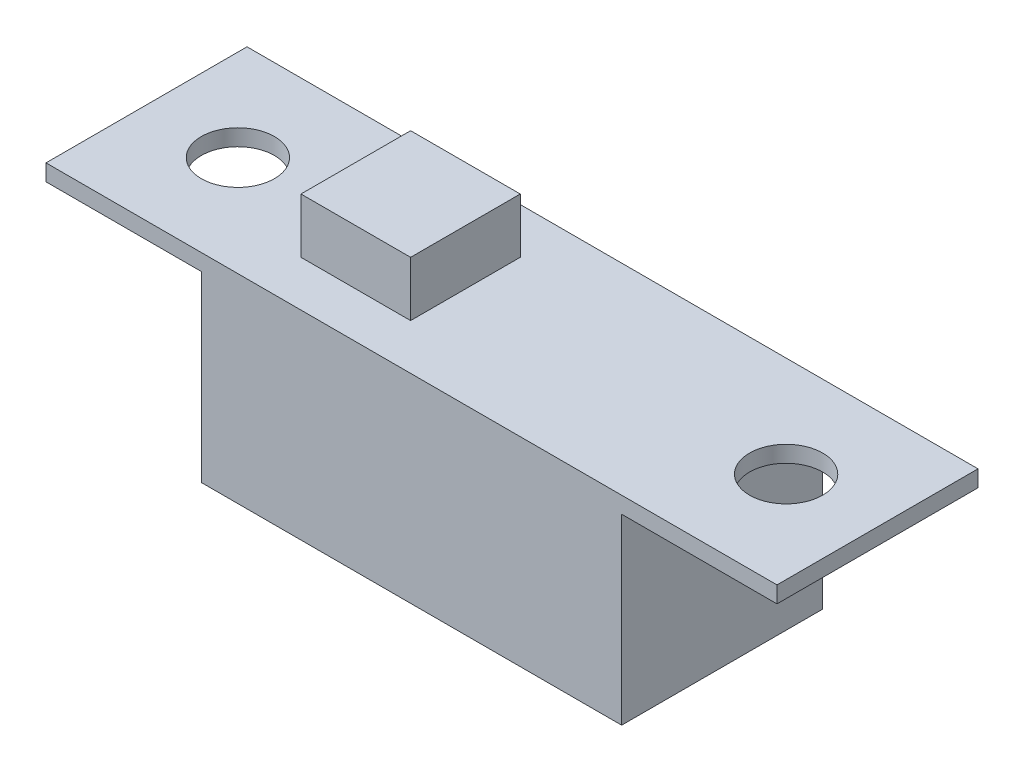
ISO-10303-21;
HEADER;
FILE_DESCRIPTION(('STEP AP214'),'2;1');
FILE_NAME('part.step','',(''),(''),'','','');
FILE_SCHEMA(('AUTOMOTIVE_DESIGN { 1 0 10303 214 1 1 1 1 }'));
ENDSEC;
DATA;
#1=APPLICATION_CONTEXT('core data for automotive mechanical design processes');
#2=APPLICATION_PROTOCOL_DEFINITION('international standard','automotive_design',2000,#1);
#3=PRODUCT_CONTEXT('',#1,'mechanical');
#4=PRODUCT('Part','Part','',(#3));
#5=PRODUCT_RELATED_PRODUCT_CATEGORY('part','',(#4));
#6=PRODUCT_DEFINITION_FORMATION('','',#4);
#7=PRODUCT_DEFINITION_CONTEXT('part definition',#1,'design');
#8=PRODUCT_DEFINITION('design','',#6,#7);
#9=PRODUCT_DEFINITION_SHAPE('','',#8);
#10=(LENGTH_UNIT() NAMED_UNIT(*) SI_UNIT(.MILLI.,.METRE.));
#11=(NAMED_UNIT(*) PLANE_ANGLE_UNIT() SI_UNIT($,.RADIAN.));
#12=(NAMED_UNIT(*) SI_UNIT($,.STERADIAN.) SOLID_ANGLE_UNIT());
#13=UNCERTAINTY_MEASURE_WITH_UNIT(LENGTH_MEASURE(1.E-05),#10,'distance_accuracy_value','');
#14=(GEOMETRIC_REPRESENTATION_CONTEXT(3) GLOBAL_UNCERTAINTY_ASSIGNED_CONTEXT((#13)) GLOBAL_UNIT_ASSIGNED_CONTEXT((#10,
#11,#12)) REPRESENTATION_CONTEXT('',''));
#15=CARTESIAN_POINT('',(0.,0.,0.));
#16=DIRECTION('',(0.,0.,1.));
#17=DIRECTION('',(1.,0.,0.));
#18=AXIS2_PLACEMENT_3D('',#15,#16,#17);
#19=CARTESIAN_POINT('',(0.,0.45,0.));
#20=DIRECTION('',(0.,-1.,0.));
#21=DIRECTION('',(0.,0.,-1.));
#22=AXIS2_PLACEMENT_3D('',#19,#20,#21);
#23=PLANE('',#22);
#24=CARTESIAN_POINT('',(7.5,0.45,0.));
#25=DIRECTION('',(0.,1.,0.));
#26=DIRECTION('',(0.,0.,1.));
#27=AXIS2_PLACEMENT_3D('',#24,#25,#26);
#28=CIRCLE('',#27,1.);
#29=CARTESIAN_POINT('',(7.5,0.45,0.999999999999998));
#30=VERTEX_POINT('',#29);
#31=EDGE_CURVE('E180',#30,#30,#28,.T.);
#32=ORIENTED_EDGE('',*,*,#31,.F.);
#33=EDGE_LOOP('',(#32));
#34=FACE_BOUND('',#33,.T.);
#35=CARTESIAN_POINT('',(-7.5,0.45,0.));
#36=DIRECTION('',(0.,1.,0.));
#37=DIRECTION('',(0.,0.,1.));
#38=AXIS2_PLACEMENT_3D('',#35,#36,#37);
#39=CIRCLE('',#38,1.);
#40=CARTESIAN_POINT('',(-7.5,0.45,1.));
#41=VERTEX_POINT('',#40);
#42=EDGE_CURVE('E186',#41,#41,#39,.T.);
#43=ORIENTED_EDGE('',*,*,#42,.F.);
#44=EDGE_LOOP('',(#43));
#45=FACE_BOUND('',#44,.T.);
#46=DIRECTION('',(0.,0.,-1.));
#47=VECTOR('',#46,1.);
#48=CARTESIAN_POINT('',(10.,0.45,2.75));
#49=LINE('',#48,#47);
#50=CARTESIAN_POINT('',(10.,0.45,2.75));
#51=VERTEX_POINT('',#50);
#52=CARTESIAN_POINT('',(10.,0.45,-2.75));
#53=VERTEX_POINT('',#52);
#54=EDGE_CURVE('E192',#51,#53,#49,.T.);
#55=ORIENTED_EDGE('',*,*,#54,.T.);
#56=DIRECTION('',(-1.,0.,0.));
#57=VECTOR('',#56,1.);
#58=CARTESIAN_POINT('',(-10.,0.45,-2.75));
#59=LINE('',#58,#57);
#60=CARTESIAN_POINT('',(-10.,0.45,-2.75));
#61=VERTEX_POINT('',#60);
#62=EDGE_CURVE('E195',#53,#61,#59,.T.);
#63=ORIENTED_EDGE('',*,*,#62,.T.);
#64=DIRECTION('',(0.,0.,1.));
#65=VECTOR('',#64,1.);
#66=CARTESIAN_POINT('',(-10.,0.45,2.75));
#67=LINE('',#66,#65);
#68=CARTESIAN_POINT('',(-10.,0.45,2.75));
#69=VERTEX_POINT('',#68);
#70=EDGE_CURVE('E198',#61,#69,#67,.T.);
#71=ORIENTED_EDGE('',*,*,#70,.T.);
#72=DIRECTION('',(1.,0.,0.));
#73=VECTOR('',#72,1.);
#74=CARTESIAN_POINT('',(-10.,0.45,2.75));
#75=LINE('',#74,#73);
#76=EDGE_CURVE('E200',#69,#51,#75,.T.);
#77=ORIENTED_EDGE('',*,*,#76,.T.);
#78=EDGE_LOOP('',(#55,#63,#71,#77));
#79=FACE_BOUND('',#78,.T.);
#80=DIRECTION('',(0.,0.,-1.));
#81=VECTOR('',#80,1.);
#82=CARTESIAN_POINT('',(-1.27416727073545,0.45,-1.5));
#83=LINE('',#82,#81);
#84=CARTESIAN_POINT('',(-1.27416727073545,0.45,1.5));
#85=VERTEX_POINT('',#84);
#86=CARTESIAN_POINT('',(-1.27416727073545,0.45,-1.5));
#87=VERTEX_POINT('',#86);
#88=EDGE_CURVE('E146',#85,#87,#83,.T.);
#89=ORIENTED_EDGE('',*,*,#88,.F.);
#90=DIRECTION('',(1.,0.,0.));
#91=VECTOR('',#90,1.);
#92=CARTESIAN_POINT('',(-4.27416727073545,0.45,1.5));
#93=LINE('',#92,#91);
#94=CARTESIAN_POINT('',(-4.27416727073545,0.45,1.5));
#95=VERTEX_POINT('',#94);
#96=EDGE_CURVE('E143',#95,#85,#93,.T.);
#97=ORIENTED_EDGE('',*,*,#96,.F.);
#98=DIRECTION('',(0.,0.,1.));
#99=VECTOR('',#98,1.);
#100=CARTESIAN_POINT('',(-4.27416727073545,0.45,-1.5));
#101=LINE('',#100,#99);
#102=CARTESIAN_POINT('',(-4.27416727073545,0.45,-1.5));
#103=VERTEX_POINT('',#102);
#104=EDGE_CURVE('E57',#103,#95,#101,.T.);
#105=ORIENTED_EDGE('',*,*,#104,.F.);
#106=DIRECTION('',(-1.,0.,0.));
#107=VECTOR('',#106,1.);
#108=CARTESIAN_POINT('',(-4.27416727073545,0.45,-1.5));
#109=LINE('',#108,#107);
#110=EDGE_CURVE('E52',#87,#103,#109,.T.);
#111=ORIENTED_EDGE('',*,*,#110,.F.);
#112=EDGE_LOOP('',(#89,#97,#105,#111));
#113=FACE_BOUND('',#112,.T.);
#114=ADVANCED_FACE('F37',(#34,#45,#79,#113),#23,.F.);
#115=CARTESIAN_POINT('',(0.,0.,0.));
#116=DIRECTION('',(0.,-1.,0.));
#117=DIRECTION('',(0.,0.,-1.));
#118=AXIS2_PLACEMENT_3D('',#115,#116,#117);
#119=PLANE('',#118);
#120=DIRECTION('',(0.,0.,-1.));
#121=VECTOR('',#120,1.);
#122=CARTESIAN_POINT('',(-5.75,0.,2.75));
#123=LINE('',#122,#121);
#124=CARTESIAN_POINT('',(-5.75,0.,2.75));
#125=VERTEX_POINT('',#124);
#126=CARTESIAN_POINT('',(-5.75,0.,-2.75));
#127=VERTEX_POINT('',#126);
#128=EDGE_CURVE('E147',#125,#127,#123,.T.);
#129=ORIENTED_EDGE('',*,*,#128,.F.);
#130=DIRECTION('',(1.,0.,0.));
#131=VECTOR('',#130,1.);
#132=CARTESIAN_POINT('',(-10.,0.,2.75));
#133=LINE('',#132,#131);
#134=CARTESIAN_POINT('',(-10.,0.,2.75));
#135=VERTEX_POINT('',#134);
#136=EDGE_CURVE('E196',#135,#125,#133,.T.);
#137=ORIENTED_EDGE('',*,*,#136,.F.);
#138=DIRECTION('',(0.,0.,1.));
#139=VECTOR('',#138,1.);
#140=CARTESIAN_POINT('',(-10.,0.,2.75));
#141=LINE('',#140,#139);
#142=CARTESIAN_POINT('',(-10.,0.,-2.75));
#143=VERTEX_POINT('',#142);
#144=EDGE_CURVE('E209',#143,#135,#141,.T.);
#145=ORIENTED_EDGE('',*,*,#144,.F.);
#146=DIRECTION('',(-1.,0.,0.));
#147=VECTOR('',#146,1.);
#148=CARTESIAN_POINT('',(-10.,0.,-2.75));
#149=LINE('',#148,#147);
#150=EDGE_CURVE('E205',#127,#143,#149,.T.);
#151=ORIENTED_EDGE('',*,*,#150,.F.);
#152=EDGE_LOOP('',(#129,#137,#145,#151));
#153=FACE_BOUND('',#152,.T.);
#154=CARTESIAN_POINT('',(-7.5,0.,0.));
#155=DIRECTION('',(0.,1.,0.));
#156=DIRECTION('',(0.,0.,1.));
#157=AXIS2_PLACEMENT_3D('',#154,#155,#156);
#158=CIRCLE('',#157,1.);
#159=CARTESIAN_POINT('',(-7.5,0.,1.));
#160=VERTEX_POINT('',#159);
#161=EDGE_CURVE('E183',#160,#160,#158,.T.);
#162=ORIENTED_EDGE('',*,*,#161,.T.);
#163=EDGE_LOOP('',(#162));
#164=FACE_BOUND('',#163,.T.);
#165=ADVANCED_FACE('F228',(#153,#164),#119,.T.);
#166=DIRECTION('',(0.,0.,1.));
#167=VECTOR('',#166,1.);
#168=CARTESIAN_POINT('',(5.75,0.,2.75));
#169=LINE('',#168,#167);
#170=CARTESIAN_POINT('',(5.75,0.,-2.75));
#171=VERTEX_POINT('',#170);
#172=CARTESIAN_POINT('',(5.75,0.,2.75));
#173=VERTEX_POINT('',#172);
#174=EDGE_CURVE('E150',#171,#173,#169,.T.);
#175=ORIENTED_EDGE('',*,*,#174,.F.);
#176=CARTESIAN_POINT('',(10.,0.,-2.75));
#177=VERTEX_POINT('',#176);
#178=EDGE_CURVE('E206',#177,#171,#149,.T.);
#179=ORIENTED_EDGE('',*,*,#178,.F.);
#180=DIRECTION('',(0.,0.,-1.));
#181=VECTOR('',#180,1.);
#182=CARTESIAN_POINT('',(10.,0.,2.75));
#183=LINE('',#182,#181);
#184=CARTESIAN_POINT('',(10.,0.,2.75));
#185=VERTEX_POINT('',#184);
#186=EDGE_CURVE('E189',#185,#177,#183,.T.);
#187=ORIENTED_EDGE('',*,*,#186,.F.);
#188=EDGE_CURVE('E211',#173,#185,#133,.T.);
#189=ORIENTED_EDGE('',*,*,#188,.F.);
#190=EDGE_LOOP('',(#175,#179,#187,#189));
#191=FACE_BOUND('',#190,.T.);
#192=CARTESIAN_POINT('',(7.5,0.,0.));
#193=DIRECTION('',(0.,1.,0.));
#194=DIRECTION('',(0.,0.,1.));
#195=AXIS2_PLACEMENT_3D('',#192,#193,#194);
#196=CIRCLE('',#195,1.);
#197=CARTESIAN_POINT('',(7.5,0.,0.999999999999998));
#198=VERTEX_POINT('',#197);
#199=EDGE_CURVE('E179',#198,#198,#196,.T.);
#200=ORIENTED_EDGE('',*,*,#199,.T.);
#201=EDGE_LOOP('',(#200));
#202=FACE_BOUND('',#201,.T.);
#203=ADVANCED_FACE('F248',(#191,#202),#119,.T.);
#204=CARTESIAN_POINT('',(10.,0.45,2.75));
#205=DIRECTION('',(-1.,0.,0.));
#206=DIRECTION('',(0.,0.,1.));
#207=AXIS2_PLACEMENT_3D('',#204,#205,#206);
#208=PLANE('',#207);
#209=ORIENTED_EDGE('',*,*,#186,.T.);
#210=DIRECTION('',(0.,-1.,0.));
#211=VECTOR('',#210,1.);
#212=CARTESIAN_POINT('',(10.,0.45,-2.75));
#213=LINE('',#212,#211);
#214=EDGE_CURVE('E11',#53,#177,#213,.T.);
#215=ORIENTED_EDGE('',*,*,#214,.F.);
#216=ORIENTED_EDGE('',*,*,#54,.F.);
#217=DIRECTION('',(0.,-1.,0.));
#218=VECTOR('',#217,1.);
#219=CARTESIAN_POINT('',(10.,0.45,2.75));
#220=LINE('',#219,#218);
#221=EDGE_CURVE('E202',#51,#185,#220,.T.);
#222=ORIENTED_EDGE('',*,*,#221,.T.);
#223=EDGE_LOOP('',(#209,#215,#216,#222));
#224=FACE_BOUND('',#223,.T.);
#225=ADVANCED_FACE('F39',(#224),#208,.F.);
#226=CARTESIAN_POINT('',(-10.,0.45,-2.75));
#227=DIRECTION('',(0.,0.,1.));
#228=DIRECTION('',(1.,0.,0.));
#229=AXIS2_PLACEMENT_3D('',#226,#227,#228);
#230=PLANE('',#229);
#231=ORIENTED_EDGE('',*,*,#178,.T.);
#232=DIRECTION('',(0.,1.,0.));
#233=VECTOR('',#232,1.);
#234=CARTESIAN_POINT('',(5.75,-5.,-2.75));
#235=LINE('',#234,#233);
#236=CARTESIAN_POINT('',(5.75,-5.,-2.75));
#237=VERTEX_POINT('',#236);
#238=EDGE_CURVE('E173',#237,#171,#235,.T.);
#239=ORIENTED_EDGE('',*,*,#238,.F.);
#240=DIRECTION('',(1.,0.,0.));
#241=VECTOR('',#240,1.);
#242=CARTESIAN_POINT('',(5.75,-5.,-2.75));
#243=LINE('',#242,#241);
#244=CARTESIAN_POINT('',(-5.75,-5.,-2.75));
#245=VERTEX_POINT('',#244);
#246=EDGE_CURVE('E159',#245,#237,#243,.T.);
#247=ORIENTED_EDGE('',*,*,#246,.F.);
#248=DIRECTION('',(0.,1.,0.));
#249=VECTOR('',#248,1.);
#250=CARTESIAN_POINT('',(-5.75,-5.,-2.75));
#251=LINE('',#250,#249);
#252=EDGE_CURVE('E176',#245,#127,#251,.T.);
#253=ORIENTED_EDGE('',*,*,#252,.T.);
#254=ORIENTED_EDGE('',*,*,#150,.T.);
#255=DIRECTION('',(0.,-1.,0.));
#256=VECTOR('',#255,1.);
#257=CARTESIAN_POINT('',(-10.,0.45,-2.75));
#258=LINE('',#257,#256);
#259=EDGE_CURVE('E45',#61,#143,#258,.T.);
#260=ORIENTED_EDGE('',*,*,#259,.F.);
#261=ORIENTED_EDGE('',*,*,#62,.F.);
#262=ORIENTED_EDGE('',*,*,#214,.T.);
#263=EDGE_LOOP('',(#231,#239,#247,#253,#254,#260,#261,#262));
#264=FACE_BOUND('',#263,.T.);
#265=ADVANCED_FACE('F251',(#264),#230,.F.);
#266=CARTESIAN_POINT('',(-10.,0.45,2.75));
#267=DIRECTION('',(1.,0.,0.));
#268=DIRECTION('',(0.,0.,-1.));
#269=AXIS2_PLACEMENT_3D('',#266,#267,#268);
#270=PLANE('',#269);
#271=ORIENTED_EDGE('',*,*,#144,.T.);
#272=DIRECTION('',(0.,-1.,0.));
#273=VECTOR('',#272,1.);
#274=CARTESIAN_POINT('',(-10.,0.45,2.75));
#275=LINE('',#274,#273);
#276=EDGE_CURVE('E216',#69,#135,#275,.T.);
#277=ORIENTED_EDGE('',*,*,#276,.F.);
#278=ORIENTED_EDGE('',*,*,#70,.F.);
#279=ORIENTED_EDGE('',*,*,#259,.T.);
#280=EDGE_LOOP('',(#271,#277,#278,#279));
#281=FACE_BOUND('',#280,.T.);
#282=ADVANCED_FACE('F223',(#281),#270,.F.);
#283=CARTESIAN_POINT('',(-10.,0.45,2.75));
#284=DIRECTION('',(0.,0.,-1.));
#285=DIRECTION('',(-1.,0.,0.));
#286=AXIS2_PLACEMENT_3D('',#283,#284,#285);
#287=PLANE('',#286);
#288=ORIENTED_EDGE('',*,*,#136,.T.);
#289=DIRECTION('',(0.,1.,0.));
#290=VECTOR('',#289,1.);
#291=CARTESIAN_POINT('',(-5.75,-5.,2.75));
#292=LINE('',#291,#290);
#293=CARTESIAN_POINT('',(-5.75,-5.,2.75));
#294=VERTEX_POINT('',#293);
#295=EDGE_CURVE('E164',#294,#125,#292,.T.);
#296=ORIENTED_EDGE('',*,*,#295,.F.);
#297=DIRECTION('',(-1.,0.,0.));
#298=VECTOR('',#297,1.);
#299=CARTESIAN_POINT('',(5.75,-5.,2.75));
#300=LINE('',#299,#298);
#301=CARTESIAN_POINT('',(5.75,-5.,2.75));
#302=VERTEX_POINT('',#301);
#303=EDGE_CURVE('E163',#302,#294,#300,.T.);
#304=ORIENTED_EDGE('',*,*,#303,.F.);
#305=DIRECTION('',(0.,1.,0.));
#306=VECTOR('',#305,1.);
#307=CARTESIAN_POINT('',(5.75,-5.,2.75));
#308=LINE('',#307,#306);
#309=EDGE_CURVE('E170',#302,#173,#308,.T.);
#310=ORIENTED_EDGE('',*,*,#309,.T.);
#311=ORIENTED_EDGE('',*,*,#188,.T.);
#312=ORIENTED_EDGE('',*,*,#221,.F.);
#313=ORIENTED_EDGE('',*,*,#76,.F.);
#314=ORIENTED_EDGE('',*,*,#276,.T.);
#315=EDGE_LOOP('',(#288,#296,#304,#310,#311,#312,#313,#314));
#316=FACE_BOUND('',#315,.T.);
#317=ADVANCED_FACE('F232',(#316),#287,.F.);
#318=CARTESIAN_POINT('',(-7.5,0.45,0.));
#319=DIRECTION('',(0.,-1.,0.));
#320=DIRECTION('',(0.,0.,-1.));
#321=AXIS2_PLACEMENT_3D('',#318,#319,#320);
#322=CYLINDRICAL_SURFACE('',#321,1.);
#323=ORIENTED_EDGE('',*,*,#42,.T.);
#324=EDGE_LOOP('',(#323));
#325=FACE_BOUND('',#324,.T.);
#326=ORIENTED_EDGE('',*,*,#161,.F.);
#327=EDGE_LOOP('',(#326));
#328=FACE_BOUND('',#327,.T.);
#329=ADVANCED_FACE('F295',(#325,#328),#322,.F.);
#330=CARTESIAN_POINT('',(7.5,0.45,0.));
#331=DIRECTION('',(0.,-1.,0.));
#332=DIRECTION('',(0.,0.,-1.));
#333=AXIS2_PLACEMENT_3D('',#330,#331,#332);
#334=CYLINDRICAL_SURFACE('',#333,1.);
#335=ORIENTED_EDGE('',*,*,#31,.T.);
#336=EDGE_LOOP('',(#335));
#337=FACE_BOUND('',#336,.T.);
#338=ORIENTED_EDGE('',*,*,#199,.F.);
#339=EDGE_LOOP('',(#338));
#340=FACE_BOUND('',#339,.T.);
#341=ADVANCED_FACE('F292',(#337,#340),#334,.F.);
#342=CARTESIAN_POINT('',(-5.75,-5.,2.75));
#343=DIRECTION('',(1.,0.,0.));
#344=DIRECTION('',(0.,0.,-1.));
#345=AXIS2_PLACEMENT_3D('',#342,#343,#344);
#346=PLANE('',#345);
#347=ORIENTED_EDGE('',*,*,#128,.T.);
#348=ORIENTED_EDGE('',*,*,#252,.F.);
#349=DIRECTION('',(0.,0.,-1.));
#350=VECTOR('',#349,1.);
#351=CARTESIAN_POINT('',(-5.75,-5.,2.75));
#352=LINE('',#351,#350);
#353=EDGE_CURVE('E156',#294,#245,#352,.T.);
#354=ORIENTED_EDGE('',*,*,#353,.F.);
#355=ORIENTED_EDGE('',*,*,#295,.T.);
#356=EDGE_LOOP('',(#347,#348,#354,#355));
#357=FACE_BOUND('',#356,.T.);
#358=ADVANCED_FACE('F237',(#357),#346,.F.);
#359=CARTESIAN_POINT('',(5.75,-5.,2.75));
#360=DIRECTION('',(-1.,0.,0.));
#361=DIRECTION('',(0.,0.,1.));
#362=AXIS2_PLACEMENT_3D('',#359,#360,#361);
#363=PLANE('',#362);
#364=ORIENTED_EDGE('',*,*,#174,.T.);
#365=ORIENTED_EDGE('',*,*,#309,.F.);
#366=DIRECTION('',(0.,0.,1.));
#367=VECTOR('',#366,1.);
#368=CARTESIAN_POINT('',(5.75,-5.,2.75));
#369=LINE('',#368,#367);
#370=EDGE_CURVE('E161',#237,#302,#369,.T.);
#371=ORIENTED_EDGE('',*,*,#370,.F.);
#372=ORIENTED_EDGE('',*,*,#238,.T.);
#373=EDGE_LOOP('',(#364,#365,#371,#372));
#374=FACE_BOUND('',#373,.T.);
#375=ADVANCED_FACE('F246',(#374),#363,.F.);
#376=CARTESIAN_POINT('',(0.,-5.,0.));
#377=DIRECTION('',(0.,1.,0.));
#378=DIRECTION('',(0.,0.,1.));
#379=AXIS2_PLACEMENT_3D('',#376,#377,#378);
#380=PLANE('',#379);
#381=ORIENTED_EDGE('',*,*,#353,.T.);
#382=ORIENTED_EDGE('',*,*,#246,.T.);
#383=ORIENTED_EDGE('',*,*,#370,.T.);
#384=ORIENTED_EDGE('',*,*,#303,.T.);
#385=EDGE_LOOP('',(#381,#382,#383,#384));
#386=FACE_BOUND('',#385,.T.);
#387=ADVANCED_FACE('F240',(#386),#380,.F.);
#388=CARTESIAN_POINT('',(-1.27416727073545,1.95,-1.5));
#389=DIRECTION('',(-1.,0.,0.));
#390=DIRECTION('',(0.,0.,1.));
#391=AXIS2_PLACEMENT_3D('',#388,#389,#390);
#392=PLANE('',#391);
#393=ORIENTED_EDGE('',*,*,#88,.T.);
#394=DIRECTION('',(0.,-1.,0.));
#395=VECTOR('',#394,1.);
#396=CARTESIAN_POINT('',(-1.27416727073545,1.95,-1.5));
#397=LINE('',#396,#395);
#398=CARTESIAN_POINT('',(-1.27416727073545,1.95,-1.5));
#399=VERTEX_POINT('',#398);
#400=EDGE_CURVE('E127',#399,#87,#397,.T.);
#401=ORIENTED_EDGE('',*,*,#400,.F.);
#402=DIRECTION('',(0.,0.,-1.));
#403=VECTOR('',#402,1.);
#404=CARTESIAN_POINT('',(-1.27416727073545,1.95,-1.5));
#405=LINE('',#404,#403);
#406=CARTESIAN_POINT('',(-1.27416727073545,1.95,1.5));
#407=VERTEX_POINT('',#406);
#408=EDGE_CURVE('E134',#407,#399,#405,.T.);
#409=ORIENTED_EDGE('',*,*,#408,.F.);
#410=DIRECTION('',(0.,-1.,0.));
#411=VECTOR('',#410,1.);
#412=CARTESIAN_POINT('',(-1.27416727073545,1.95,1.5));
#413=LINE('',#412,#411);
#414=EDGE_CURVE('E264',#407,#85,#413,.T.);
#415=ORIENTED_EDGE('',*,*,#414,.T.);
#416=EDGE_LOOP('',(#393,#401,#409,#415));
#417=FACE_BOUND('',#416,.T.);
#418=ADVANCED_FACE('F145',(#417),#392,.F.);
#419=CARTESIAN_POINT('',(-4.27416727073545,1.95,-1.5));
#420=DIRECTION('',(0.,0.,1.));
#421=DIRECTION('',(1.,0.,0.));
#422=AXIS2_PLACEMENT_3D('',#419,#420,#421);
#423=PLANE('',#422);
#424=ORIENTED_EDGE('',*,*,#110,.T.);
#425=DIRECTION('',(0.,-1.,0.));
#426=VECTOR('',#425,1.);
#427=CARTESIAN_POINT('',(-4.27416727073545,1.95,-1.5));
#428=LINE('',#427,#426);
#429=CARTESIAN_POINT('',(-4.27416727073545,1.95,-1.5));
#430=VERTEX_POINT('',#429);
#431=EDGE_CURVE('E130',#430,#103,#428,.T.);
#432=ORIENTED_EDGE('',*,*,#431,.F.);
#433=DIRECTION('',(-1.,0.,0.));
#434=VECTOR('',#433,1.);
#435=CARTESIAN_POINT('',(-4.27416727073545,1.95,-1.5));
#436=LINE('',#435,#434);
#437=EDGE_CURVE('E123',#399,#430,#436,.T.);
#438=ORIENTED_EDGE('',*,*,#437,.F.);
#439=ORIENTED_EDGE('',*,*,#400,.T.);
#440=EDGE_LOOP('',(#424,#432,#438,#439));
#441=FACE_BOUND('',#440,.T.);
#442=ADVANCED_FACE('F125',(#441),#423,.F.);
#443=CARTESIAN_POINT('',(-4.27416727073545,1.95,-1.5));
#444=DIRECTION('',(1.,0.,0.));
#445=DIRECTION('',(0.,0.,-1.));
#446=AXIS2_PLACEMENT_3D('',#443,#444,#445);
#447=PLANE('',#446);
#448=ORIENTED_EDGE('',*,*,#104,.T.);
#449=DIRECTION('',(0.,-1.,0.));
#450=VECTOR('',#449,1.);
#451=CARTESIAN_POINT('',(-4.27416727073545,1.95,1.5));
#452=LINE('',#451,#450);
#453=CARTESIAN_POINT('',(-4.27416727073545,1.95,1.5));
#454=VERTEX_POINT('',#453);
#455=EDGE_CURVE('E152',#454,#95,#452,.T.);
#456=ORIENTED_EDGE('',*,*,#455,.F.);
#457=DIRECTION('',(0.,0.,1.));
#458=VECTOR('',#457,1.);
#459=CARTESIAN_POINT('',(-4.27416727073545,1.95,-1.5));
#460=LINE('',#459,#458);
#461=EDGE_CURVE('E133',#430,#454,#460,.T.);
#462=ORIENTED_EDGE('',*,*,#461,.F.);
#463=ORIENTED_EDGE('',*,*,#431,.T.);
#464=EDGE_LOOP('',(#448,#456,#462,#463));
#465=FACE_BOUND('',#464,.T.);
#466=ADVANCED_FACE('F273',(#465),#447,.F.);
#467=CARTESIAN_POINT('',(-4.27416727073545,1.95,1.5));
#468=DIRECTION('',(0.,0.,-1.));
#469=DIRECTION('',(-1.,0.,0.));
#470=AXIS2_PLACEMENT_3D('',#467,#468,#469);
#471=PLANE('',#470);
#472=ORIENTED_EDGE('',*,*,#96,.T.);
#473=ORIENTED_EDGE('',*,*,#414,.F.);
#474=DIRECTION('',(1.,0.,0.));
#475=VECTOR('',#474,1.);
#476=CARTESIAN_POINT('',(-4.27416727073545,1.95,1.5));
#477=LINE('',#476,#475);
#478=EDGE_CURVE('E139',#454,#407,#477,.T.);
#479=ORIENTED_EDGE('',*,*,#478,.F.);
#480=ORIENTED_EDGE('',*,*,#455,.T.);
#481=EDGE_LOOP('',(#472,#473,#479,#480));
#482=FACE_BOUND('',#481,.T.);
#483=ADVANCED_FACE('F263',(#482),#471,.F.);
#484=CARTESIAN_POINT('',(0.,1.95,0.));
#485=DIRECTION('',(0.,1.,0.));
#486=DIRECTION('',(0.,0.,1.));
#487=AXIS2_PLACEMENT_3D('',#484,#485,#486);
#488=PLANE('',#487);
#489=ORIENTED_EDGE('',*,*,#408,.T.);
#490=ORIENTED_EDGE('',*,*,#437,.T.);
#491=ORIENTED_EDGE('',*,*,#461,.T.);
#492=ORIENTED_EDGE('',*,*,#478,.T.);
#493=EDGE_LOOP('',(#489,#490,#491,#492));
#494=FACE_BOUND('',#493,.T.);
#495=ADVANCED_FACE('F137',(#494),#488,.T.);
#496=CLOSED_SHELL('',(#114,#165,#203,#225,#265,#282,#317,#329,#341,#358,#375,#387,#418,#442,
#466,#483,#495));
#497=MANIFOLD_SOLID_BREP('B2',#496);
#498=ADVANCED_BREP_SHAPE_REPRESENTATION('',(#18,#497),#14);
#499=SHAPE_DEFINITION_REPRESENTATION(#9,#498);
ENDSEC;
END-ISO-10303-21;
